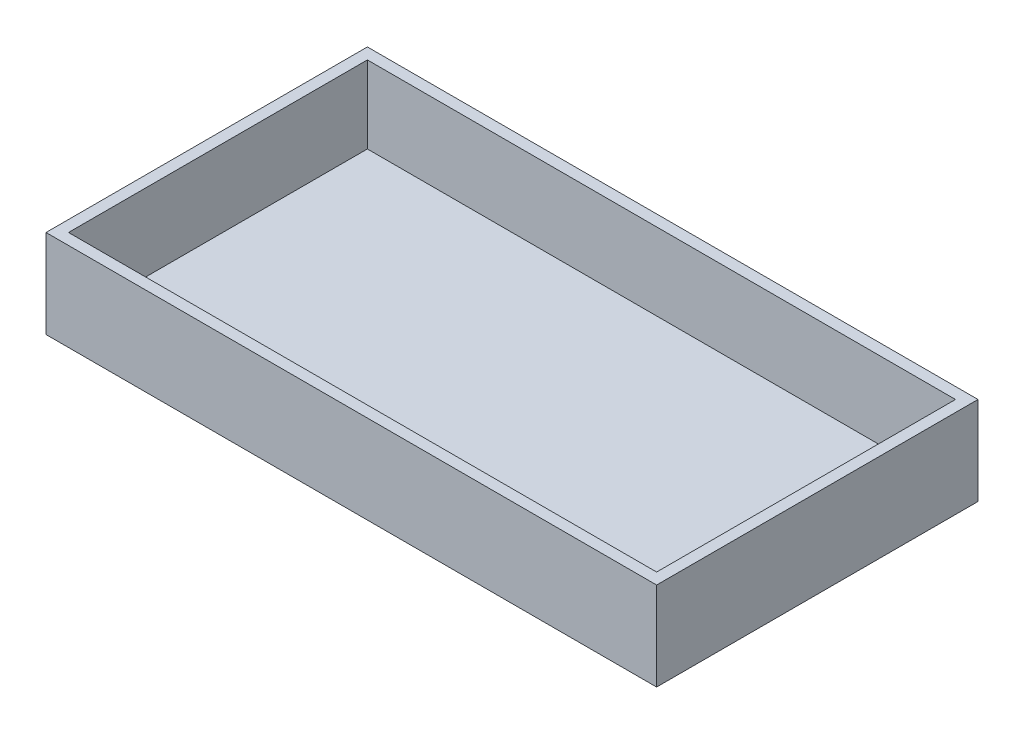
ISO-10303-21;
HEADER;
FILE_DESCRIPTION(('STEP AP214'),'2;1');
FILE_NAME('part.step','',(''),(''),'','','');
FILE_SCHEMA(('AUTOMOTIVE_DESIGN { 1 0 10303 214 1 1 1 1 }'));
ENDSEC;
DATA;
#1=APPLICATION_CONTEXT('core data for automotive mechanical design processes');
#2=APPLICATION_PROTOCOL_DEFINITION('international standard','automotive_design',2000,#1);
#3=PRODUCT_CONTEXT('',#1,'mechanical');
#4=PRODUCT('Part','Part','',(#3));
#5=PRODUCT_RELATED_PRODUCT_CATEGORY('part','',(#4));
#6=PRODUCT_DEFINITION_FORMATION('','',#4);
#7=PRODUCT_DEFINITION_CONTEXT('part definition',#1,'design');
#8=PRODUCT_DEFINITION('design','',#6,#7);
#9=PRODUCT_DEFINITION_SHAPE('','',#8);
#10=(LENGTH_UNIT() NAMED_UNIT(*) SI_UNIT(.MILLI.,.METRE.));
#11=(NAMED_UNIT(*) PLANE_ANGLE_UNIT() SI_UNIT($,.RADIAN.));
#12=(NAMED_UNIT(*) SI_UNIT($,.STERADIAN.) SOLID_ANGLE_UNIT());
#13=UNCERTAINTY_MEASURE_WITH_UNIT(LENGTH_MEASURE(1.E-05),#10,'distance_accuracy_value','');
#14=(GEOMETRIC_REPRESENTATION_CONTEXT(3) GLOBAL_UNCERTAINTY_ASSIGNED_CONTEXT((#13)) GLOBAL_UNIT_ASSIGNED_CONTEXT((#10,
#11,#12)) REPRESENTATION_CONTEXT('',''));
#15=CARTESIAN_POINT('',(0.,0.,0.));
#16=DIRECTION('',(0.,0.,1.));
#17=DIRECTION('',(1.,0.,0.));
#18=AXIS2_PLACEMENT_3D('',#15,#16,#17);
#19=CARTESIAN_POINT('',(-190.,55.,100.));
#20=DIRECTION('',(1.,0.,0.));
#21=DIRECTION('',(0.,0.,-1.));
#22=AXIS2_PLACEMENT_3D('',#19,#20,#21);
#23=PLANE('',#22);
#24=DIRECTION('',(0.,0.,1.));
#25=VECTOR('',#24,1.);
#26=CARTESIAN_POINT('',(-190.,0.,100.));
#27=LINE('',#26,#25);
#28=CARTESIAN_POINT('',(-190.,0.,-100.));
#29=VERTEX_POINT('',#28);
#30=CARTESIAN_POINT('',(-190.,0.,100.));
#31=VERTEX_POINT('',#30);
#32=EDGE_CURVE('E158',#29,#31,#27,.T.);
#33=ORIENTED_EDGE('',*,*,#32,.T.);
#34=DIRECTION('',(0.,-1.,0.));
#35=VECTOR('',#34,1.);
#36=CARTESIAN_POINT('',(-190.,55.,100.));
#37=LINE('',#36,#35);
#38=CARTESIAN_POINT('',(-190.,55.,100.));
#39=VERTEX_POINT('',#38);
#40=EDGE_CURVE('E11',#39,#31,#37,.T.);
#41=ORIENTED_EDGE('',*,*,#40,.F.);
#42=DIRECTION('',(0.,0.,1.));
#43=VECTOR('',#42,1.);
#44=CARTESIAN_POINT('',(-190.,55.,100.));
#45=LINE('',#44,#43);
#46=CARTESIAN_POINT('',(-190.,55.,-100.));
#47=VERTEX_POINT('',#46);
#48=EDGE_CURVE('E164',#47,#39,#45,.T.);
#49=ORIENTED_EDGE('',*,*,#48,.F.);
#50=DIRECTION('',(0.,-1.,0.));
#51=VECTOR('',#50,1.);
#52=CARTESIAN_POINT('',(-190.,55.,-100.));
#53=LINE('',#52,#51);
#54=EDGE_CURVE('E174',#47,#29,#53,.T.);
#55=ORIENTED_EDGE('',*,*,#54,.T.);
#56=EDGE_LOOP('',(#33,#41,#49,#55));
#57=FACE_BOUND('',#56,.T.);
#58=ADVANCED_FACE('F39',(#57),#23,.F.);
#59=CARTESIAN_POINT('',(190.,55.,100.));
#60=DIRECTION('',(0.,0.,-1.));
#61=DIRECTION('',(-1.,0.,0.));
#62=AXIS2_PLACEMENT_3D('',#59,#60,#61);
#63=PLANE('',#62);
#64=DIRECTION('',(1.,0.,0.));
#65=VECTOR('',#64,1.);
#66=CARTESIAN_POINT('',(190.,0.,100.));
#67=LINE('',#66,#65);
#68=CARTESIAN_POINT('',(190.,0.,100.));
#69=VERTEX_POINT('',#68);
#70=EDGE_CURVE('E178',#31,#69,#67,.T.);
#71=ORIENTED_EDGE('',*,*,#70,.T.);
#72=DIRECTION('',(0.,-1.,0.));
#73=VECTOR('',#72,1.);
#74=CARTESIAN_POINT('',(190.,55.,100.));
#75=LINE('',#74,#73);
#76=CARTESIAN_POINT('',(190.,55.,100.));
#77=VERTEX_POINT('',#76);
#78=EDGE_CURVE('E47',#77,#69,#75,.T.);
#79=ORIENTED_EDGE('',*,*,#78,.F.);
#80=DIRECTION('',(1.,0.,0.));
#81=VECTOR('',#80,1.);
#82=CARTESIAN_POINT('',(190.,55.,100.));
#83=LINE('',#82,#81);
#84=EDGE_CURVE('E91',#39,#77,#83,.T.);
#85=ORIENTED_EDGE('',*,*,#84,.F.);
#86=ORIENTED_EDGE('',*,*,#40,.T.);
#87=EDGE_LOOP('',(#71,#79,#85,#86));
#88=FACE_BOUND('',#87,.T.);
#89=ADVANCED_FACE('F213',(#88),#63,.F.);
#90=CARTESIAN_POINT('',(190.,55.,100.));
#91=DIRECTION('',(-1.,0.,0.));
#92=DIRECTION('',(0.,0.,1.));
#93=AXIS2_PLACEMENT_3D('',#90,#91,#92);
#94=PLANE('',#93);
#95=DIRECTION('',(0.,0.,-1.));
#96=VECTOR('',#95,1.);
#97=CARTESIAN_POINT('',(190.,0.,100.));
#98=LINE('',#97,#96);
#99=CARTESIAN_POINT('',(190.,0.,-100.));
#100=VERTEX_POINT('',#99);
#101=EDGE_CURVE('E181',#69,#100,#98,.T.);
#102=ORIENTED_EDGE('',*,*,#101,.T.);
#103=DIRECTION('',(0.,-1.,0.));
#104=VECTOR('',#103,1.);
#105=CARTESIAN_POINT('',(190.,55.,-100.));
#106=LINE('',#105,#104);
#107=CARTESIAN_POINT('',(190.,55.,-100.));
#108=VERTEX_POINT('',#107);
#109=EDGE_CURVE('E188',#108,#100,#106,.T.);
#110=ORIENTED_EDGE('',*,*,#109,.F.);
#111=DIRECTION('',(0.,0.,-1.));
#112=VECTOR('',#111,1.);
#113=CARTESIAN_POINT('',(190.,55.,100.));
#114=LINE('',#113,#112);
#115=EDGE_CURVE('E169',#77,#108,#114,.T.);
#116=ORIENTED_EDGE('',*,*,#115,.F.);
#117=ORIENTED_EDGE('',*,*,#78,.T.);
#118=EDGE_LOOP('',(#102,#110,#116,#117));
#119=FACE_BOUND('',#118,.T.);
#120=ADVANCED_FACE('F195',(#119),#94,.F.);
#121=CARTESIAN_POINT('',(190.,55.,-100.));
#122=DIRECTION('',(0.,0.,1.));
#123=DIRECTION('',(1.,0.,0.));
#124=AXIS2_PLACEMENT_3D('',#121,#122,#123);
#125=PLANE('',#124);
#126=DIRECTION('',(-1.,0.,0.));
#127=VECTOR('',#126,1.);
#128=CARTESIAN_POINT('',(190.,0.,-100.));
#129=LINE('',#128,#127);
#130=EDGE_CURVE('E84',#100,#29,#129,.T.);
#131=ORIENTED_EDGE('',*,*,#130,.T.);
#132=ORIENTED_EDGE('',*,*,#54,.F.);
#133=DIRECTION('',(-1.,0.,0.));
#134=VECTOR('',#133,1.);
#135=CARTESIAN_POINT('',(190.,55.,-100.));
#136=LINE('',#135,#134);
#137=EDGE_CURVE('E63',#108,#47,#136,.T.);
#138=ORIENTED_EDGE('',*,*,#137,.F.);
#139=ORIENTED_EDGE('',*,*,#109,.T.);
#140=EDGE_LOOP('',(#131,#132,#138,#139));
#141=FACE_BOUND('',#140,.T.);
#142=ADVANCED_FACE('F203',(#141),#125,.F.);
#143=CARTESIAN_POINT('',(0.,55.,0.));
#144=DIRECTION('',(0.,1.,0.));
#145=DIRECTION('',(0.,0.,1.));
#146=AXIS2_PLACEMENT_3D('',#143,#144,#145);
#147=PLANE('',#146);
#148=DIRECTION('',(0.,0.,1.));
#149=VECTOR('',#148,1.);
#150=CARTESIAN_POINT('',(-183.,55.,93.));
#151=LINE('',#150,#149);
#152=CARTESIAN_POINT('',(-183.,55.,-93.));
#153=VERTEX_POINT('',#152);
#154=CARTESIAN_POINT('',(-183.,55.,93.));
#155=VERTEX_POINT('',#154);
#156=EDGE_CURVE('E54',#153,#155,#151,.T.);
#157=ORIENTED_EDGE('',*,*,#156,.F.);
#158=DIRECTION('',(-1.,0.,0.));
#159=VECTOR('',#158,1.);
#160=CARTESIAN_POINT('',(183.,55.,-93.));
#161=LINE('',#160,#159);
#162=CARTESIAN_POINT('',(183.,55.,-93.));
#163=VERTEX_POINT('',#162);
#164=EDGE_CURVE('E136',#163,#153,#161,.T.);
#165=ORIENTED_EDGE('',*,*,#164,.F.);
#166=DIRECTION('',(0.,0.,-1.));
#167=VECTOR('',#166,1.);
#168=CARTESIAN_POINT('',(183.,55.,93.));
#169=LINE('',#168,#167);
#170=CARTESIAN_POINT('',(183.,55.,93.));
#171=VERTEX_POINT('',#170);
#172=EDGE_CURVE('E140',#171,#163,#169,.T.);
#173=ORIENTED_EDGE('',*,*,#172,.F.);
#174=DIRECTION('',(1.,0.,0.));
#175=VECTOR('',#174,1.);
#176=CARTESIAN_POINT('',(183.,55.,93.));
#177=LINE('',#176,#175);
#178=EDGE_CURVE('E149',#155,#171,#177,.T.);
#179=ORIENTED_EDGE('',*,*,#178,.F.);
#180=EDGE_LOOP('',(#157,#165,#173,#179));
#181=FACE_BOUND('',#180,.T.);
#182=ORIENTED_EDGE('',*,*,#48,.T.);
#183=ORIENTED_EDGE('',*,*,#84,.T.);
#184=ORIENTED_EDGE('',*,*,#115,.T.);
#185=ORIENTED_EDGE('',*,*,#137,.T.);
#186=EDGE_LOOP('',(#182,#183,#184,#185));
#187=FACE_BOUND('',#186,.T.);
#188=ADVANCED_FACE('F205',(#181,#187),#147,.T.);
#189=CARTESIAN_POINT('',(0.,0.,0.));
#190=DIRECTION('',(0.,1.,0.));
#191=DIRECTION('',(0.,0.,1.));
#192=AXIS2_PLACEMENT_3D('',#189,#190,#191);
#193=PLANE('',#192);
#194=ORIENTED_EDGE('',*,*,#32,.F.);
#195=ORIENTED_EDGE('',*,*,#130,.F.);
#196=ORIENTED_EDGE('',*,*,#101,.F.);
#197=ORIENTED_EDGE('',*,*,#70,.F.);
#198=EDGE_LOOP('',(#194,#195,#196,#197));
#199=FACE_BOUND('',#198,.T.);
#200=ADVANCED_FACE('F199',(#199),#193,.F.);
#201=CARTESIAN_POINT('',(-183.,7.,93.));
#202=DIRECTION('',(-1.,0.,0.));
#203=DIRECTION('',(0.,0.,1.));
#204=AXIS2_PLACEMENT_3D('',#201,#202,#203);
#205=PLANE('',#204);
#206=ORIENTED_EDGE('',*,*,#156,.T.);
#207=DIRECTION('',(0.,1.,0.));
#208=VECTOR('',#207,1.);
#209=CARTESIAN_POINT('',(-183.,7.,93.));
#210=LINE('',#209,#208);
#211=CARTESIAN_POINT('',(-183.,7.,93.));
#212=VERTEX_POINT('',#211);
#213=EDGE_CURVE('E111',#212,#155,#210,.T.);
#214=ORIENTED_EDGE('',*,*,#213,.F.);
#215=DIRECTION('',(0.,0.,1.));
#216=VECTOR('',#215,1.);
#217=CARTESIAN_POINT('',(-183.,7.,93.));
#218=LINE('',#217,#216);
#219=CARTESIAN_POINT('',(-183.,7.,-93.));
#220=VERTEX_POINT('',#219);
#221=EDGE_CURVE('E115',#220,#212,#218,.T.);
#222=ORIENTED_EDGE('',*,*,#221,.F.);
#223=DIRECTION('',(0.,1.,0.));
#224=VECTOR('',#223,1.);
#225=CARTESIAN_POINT('',(-183.,7.,-93.));
#226=LINE('',#225,#224);
#227=EDGE_CURVE('E155',#220,#153,#226,.T.);
#228=ORIENTED_EDGE('',*,*,#227,.T.);
#229=EDGE_LOOP('',(#206,#214,#222,#228));
#230=FACE_BOUND('',#229,.T.);
#231=ADVANCED_FACE('F113',(#230),#205,.F.);
#232=CARTESIAN_POINT('',(183.,7.,-93.));
#233=DIRECTION('',(0.,0.,-1.));
#234=DIRECTION('',(-1.,0.,0.));
#235=AXIS2_PLACEMENT_3D('',#232,#233,#234);
#236=PLANE('',#235);
#237=ORIENTED_EDGE('',*,*,#164,.T.);
#238=ORIENTED_EDGE('',*,*,#227,.F.);
#239=DIRECTION('',(-1.,0.,0.));
#240=VECTOR('',#239,1.);
#241=CARTESIAN_POINT('',(183.,7.,-93.));
#242=LINE('',#241,#240);
#243=CARTESIAN_POINT('',(183.,7.,-93.));
#244=VERTEX_POINT('',#243);
#245=EDGE_CURVE('E122',#244,#220,#242,.T.);
#246=ORIENTED_EDGE('',*,*,#245,.F.);
#247=DIRECTION('',(0.,1.,0.));
#248=VECTOR('',#247,1.);
#249=CARTESIAN_POINT('',(183.,7.,-93.));
#250=LINE('',#249,#248);
#251=EDGE_CURVE('E159',#244,#163,#250,.T.);
#252=ORIENTED_EDGE('',*,*,#251,.T.);
#253=EDGE_LOOP('',(#237,#238,#246,#252));
#254=FACE_BOUND('',#253,.T.);
#255=ADVANCED_FACE('F252',(#254),#236,.F.);
#256=CARTESIAN_POINT('',(183.,7.,93.));
#257=DIRECTION('',(1.,0.,0.));
#258=DIRECTION('',(0.,0.,-1.));
#259=AXIS2_PLACEMENT_3D('',#256,#257,#258);
#260=PLANE('',#259);
#261=ORIENTED_EDGE('',*,*,#172,.T.);
#262=ORIENTED_EDGE('',*,*,#251,.F.);
#263=DIRECTION('',(0.,0.,-1.));
#264=VECTOR('',#263,1.);
#265=CARTESIAN_POINT('',(183.,7.,93.));
#266=LINE('',#265,#264);
#267=CARTESIAN_POINT('',(183.,7.,93.));
#268=VERTEX_POINT('',#267);
#269=EDGE_CURVE('E131',#268,#244,#266,.T.);
#270=ORIENTED_EDGE('',*,*,#269,.F.);
#271=DIRECTION('',(0.,1.,0.));
#272=VECTOR('',#271,1.);
#273=CARTESIAN_POINT('',(183.,7.,93.));
#274=LINE('',#273,#272);
#275=EDGE_CURVE('E121',#268,#171,#274,.T.);
#276=ORIENTED_EDGE('',*,*,#275,.T.);
#277=EDGE_LOOP('',(#261,#262,#270,#276));
#278=FACE_BOUND('',#277,.T.);
#279=ADVANCED_FACE('F261',(#278),#260,.F.);
#280=CARTESIAN_POINT('',(183.,7.,93.));
#281=DIRECTION('',(0.,0.,1.));
#282=DIRECTION('',(1.,0.,0.));
#283=AXIS2_PLACEMENT_3D('',#280,#281,#282);
#284=PLANE('',#283);
#285=ORIENTED_EDGE('',*,*,#178,.T.);
#286=ORIENTED_EDGE('',*,*,#275,.F.);
#287=DIRECTION('',(1.,0.,0.));
#288=VECTOR('',#287,1.);
#289=CARTESIAN_POINT('',(183.,7.,93.));
#290=LINE('',#289,#288);
#291=EDGE_CURVE('E125',#212,#268,#290,.T.);
#292=ORIENTED_EDGE('',*,*,#291,.F.);
#293=ORIENTED_EDGE('',*,*,#213,.T.);
#294=EDGE_LOOP('',(#285,#286,#292,#293));
#295=FACE_BOUND('',#294,.T.);
#296=ADVANCED_FACE('F126',(#295),#284,.F.);
#297=CARTESIAN_POINT('',(0.,7.,0.));
#298=DIRECTION('',(0.,1.,0.));
#299=DIRECTION('',(0.,0.,1.));
#300=AXIS2_PLACEMENT_3D('',#297,#298,#299);
#301=PLANE('',#300);
#302=ORIENTED_EDGE('',*,*,#221,.T.);
#303=ORIENTED_EDGE('',*,*,#291,.T.);
#304=ORIENTED_EDGE('',*,*,#269,.T.);
#305=ORIENTED_EDGE('',*,*,#245,.T.);
#306=EDGE_LOOP('',(#302,#303,#304,#305));
#307=FACE_BOUND('',#306,.T.);
#308=ADVANCED_FACE('F133',(#307),#301,.T.);
#309=CLOSED_SHELL('',(#58,#89,#120,#142,#188,#200,#231,#255,#279,#296,#308));
#310=MANIFOLD_SOLID_BREP('B2',#309);
#311=ADVANCED_BREP_SHAPE_REPRESENTATION('',(#18,#310),#14);
#312=SHAPE_DEFINITION_REPRESENTATION(#9,#311);
ENDSEC;
END-ISO-10303-21;
